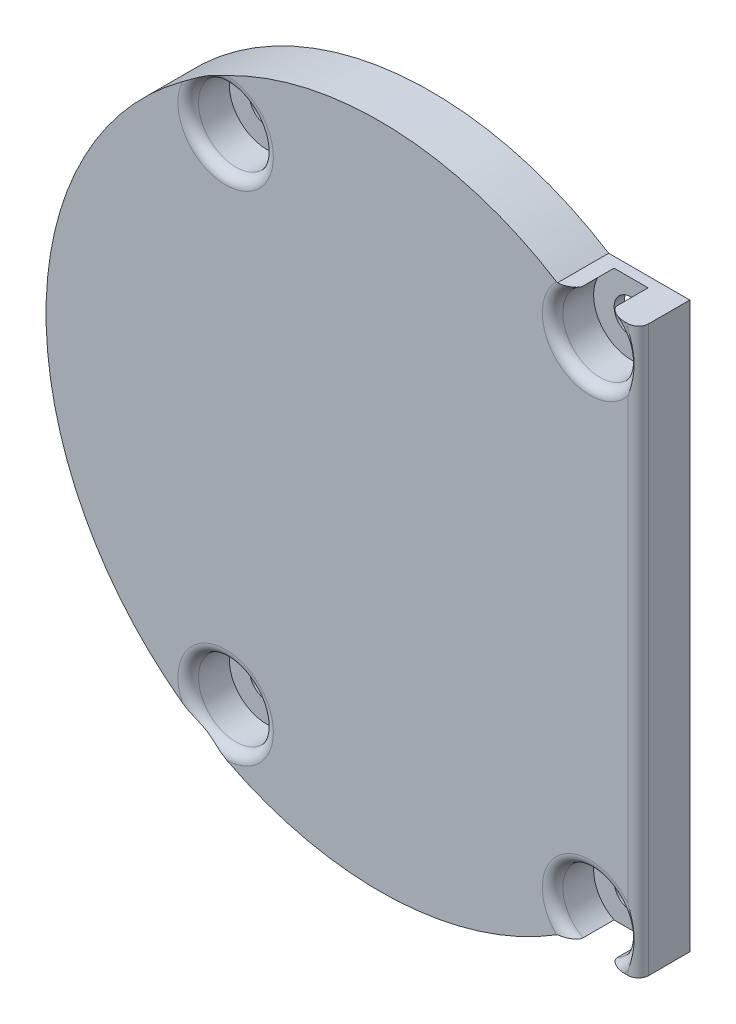
ISO-10303-21;
HEADER;
FILE_DESCRIPTION(('STEP AP214'),'2;1');
FILE_NAME('part.step','',(''),(''),'','','');
FILE_SCHEMA(('AUTOMOTIVE_DESIGN { 1 0 10303 214 1 1 1 1 }'));
ENDSEC;
DATA;
#1=APPLICATION_CONTEXT('core data for automotive mechanical design processes');
#2=APPLICATION_PROTOCOL_DEFINITION('international standard','automotive_design',2000,#1);
#3=PRODUCT_CONTEXT('',#1,'mechanical');
#4=PRODUCT('Part','Part','',(#3));
#5=PRODUCT_RELATED_PRODUCT_CATEGORY('part','',(#4));
#6=PRODUCT_DEFINITION_FORMATION('','',#4);
#7=PRODUCT_DEFINITION_CONTEXT('part definition',#1,'design');
#8=PRODUCT_DEFINITION('design','',#6,#7);
#9=PRODUCT_DEFINITION_SHAPE('','',#8);
#10=(LENGTH_UNIT() NAMED_UNIT(*) SI_UNIT(.MILLI.,.METRE.));
#11=(NAMED_UNIT(*) PLANE_ANGLE_UNIT() SI_UNIT($,.RADIAN.));
#12=(NAMED_UNIT(*) SI_UNIT($,.STERADIAN.) SOLID_ANGLE_UNIT());
#13=UNCERTAINTY_MEASURE_WITH_UNIT(LENGTH_MEASURE(1.E-05),#10,'distance_accuracy_value','');
#14=(GEOMETRIC_REPRESENTATION_CONTEXT(3) GLOBAL_UNCERTAINTY_ASSIGNED_CONTEXT((#13)) GLOBAL_UNIT_ASSIGNED_CONTEXT((#10,
#11,#12)) REPRESENTATION_CONTEXT('',''));
#15=CARTESIAN_POINT('',(0.,0.,0.));
#16=DIRECTION('',(0.,0.,1.));
#17=DIRECTION('',(1.,0.,0.));
#18=AXIS2_PLACEMENT_3D('',#15,#16,#17);
#19=CARTESIAN_POINT('',(0.,0.,5.));
#20=DIRECTION('',(0.,0.,1.));
#21=DIRECTION('',(1.,0.,0.));
#22=AXIS2_PLACEMENT_3D('',#19,#20,#21);
#23=PLANE('',#22);
#24=DIRECTION('',(-1.,0.,0.));
#25=VECTOR('',#24,1.);
#26=CARTESIAN_POINT('',(0.,-27.5,5.));
#27=LINE('',#26,#25);
#28=CARTESIAN_POINT('',(24.22,-27.5,5.));
#29=VERTEX_POINT('',#28);
#30=CARTESIAN_POINT('',(23.8256578296632,-27.5,5.));
#31=VERTEX_POINT('',#30);
#32=EDGE_CURVE('E193',#29,#31,#27,.T.);
#33=ORIENTED_EDGE('',*,*,#32,.F.);
#34=DIRECTION('',(0.,-1.,0.));
#35=VECTOR('',#34,1.);
#36=CARTESIAN_POINT('',(24.22,0.,5.));
#37=LINE('',#36,#35);
#38=CARTESIAN_POINT('',(24.22,-27.04,5.));
#39=VERTEX_POINT('',#38);
#40=EDGE_CURVE('E247',#29,#39,#37,.F.);
#41=ORIENTED_EDGE('',*,*,#40,.T.);
#42=CARTESIAN_POINT('',(20.5,-24.25,5.));
#43=DIRECTION('',(0.,0.,1.));
#44=DIRECTION('',(1.,0.,0.));
#45=AXIS2_PLACEMENT_3D('',#42,#43,#44);
#46=CIRCLE('',#45,4.65);
#47=EDGE_CURVE('E245',#39,#31,#46,.F.);
#48=ORIENTED_EDGE('',*,*,#47,.T.);
#49=EDGE_LOOP('',(#33,#41,#48));
#50=FACE_BOUND('',#49,.T.);
#51=ADVANCED_FACE('F41',(#50),#23,.T.);
#52=CARTESIAN_POINT('',(20.5,24.25,5.));
#53=DIRECTION('',(0.,0.,1.));
#54=DIRECTION('',(1.,0.,0.));
#55=AXIS2_PLACEMENT_3D('',#52,#53,#54);
#56=CIRCLE('',#55,4.65);
#57=CARTESIAN_POINT('',(23.8256578296632,27.5,5.));
#58=VERTEX_POINT('',#57);
#59=CARTESIAN_POINT('',(24.22,27.04,5.));
#60=VERTEX_POINT('',#59);
#61=EDGE_CURVE('E241',#58,#60,#56,.F.);
#62=ORIENTED_EDGE('',*,*,#61,.T.);
#63=DIRECTION('',(0.,-1.,0.));
#64=VECTOR('',#63,1.);
#65=CARTESIAN_POINT('',(24.22,0.,5.));
#66=LINE('',#65,#64);
#67=CARTESIAN_POINT('',(24.22,27.5,5.));
#68=VERTEX_POINT('',#67);
#69=EDGE_CURVE('E243',#60,#68,#66,.F.);
#70=ORIENTED_EDGE('',*,*,#69,.T.);
#71=DIRECTION('',(-1.,0.,0.));
#72=VECTOR('',#71,1.);
#73=CARTESIAN_POINT('',(0.,27.5,5.));
#74=LINE('',#73,#72);
#75=EDGE_CURVE('E184',#68,#58,#74,.T.);
#76=ORIENTED_EDGE('',*,*,#75,.T.);
#77=EDGE_LOOP('',(#62,#70,#76));
#78=FACE_BOUND('',#77,.T.);
#79=ADVANCED_FACE('F355',(#78),#23,.T.);
#80=CARTESIAN_POINT('',(-15.,24.25,5.));
#81=DIRECTION('',(0.,0.,-1.));
#82=DIRECTION('',(-1.,0.,0.));
#83=AXIS2_PLACEMENT_3D('',#80,#81,#82);
#84=CYLINDRICAL_SURFACE('',#83,1.65);
#85=CARTESIAN_POINT('',(-15.,24.25,0.));
#86=DIRECTION('',(0.,0.,1.));
#87=DIRECTION('',(1.,0.,0.));
#88=AXIS2_PLACEMENT_3D('',#85,#86,#87);
#89=CIRCLE('',#88,1.65);
#90=CARTESIAN_POINT('',(-13.35,24.25,0.));
#91=VERTEX_POINT('',#90);
#92=EDGE_CURVE('E216',#91,#91,#89,.T.);
#93=ORIENTED_EDGE('',*,*,#92,.F.);
#94=EDGE_LOOP('',(#93));
#95=FACE_BOUND('',#94,.T.);
#96=CARTESIAN_POINT('',(-15.,24.25,1.));
#97=DIRECTION('',(0.,0.,1.));
#98=DIRECTION('',(1.,0.,0.));
#99=AXIS2_PLACEMENT_3D('',#96,#97,#98);
#100=CIRCLE('',#99,1.65);
#101=CARTESIAN_POINT('',(-13.35,24.25,1.));
#102=VERTEX_POINT('',#101);
#103=EDGE_CURVE('E201',#102,#102,#100,.T.);
#104=ORIENTED_EDGE('',*,*,#103,.T.);
#105=EDGE_LOOP('',(#104));
#106=FACE_BOUND('',#105,.T.);
#107=ADVANCED_FACE('F363',(#95,#106),#84,.F.);
#108=CARTESIAN_POINT('',(20.5,24.25,5.));
#109=DIRECTION('',(0.,0.,-1.));
#110=DIRECTION('',(-1.,0.,0.));
#111=AXIS2_PLACEMENT_3D('',#108,#109,#110);
#112=CYLINDRICAL_SURFACE('',#111,1.65);
#113=CARTESIAN_POINT('',(20.5,24.25,0.));
#114=DIRECTION('',(0.,0.,1.));
#115=DIRECTION('',(1.,0.,0.));
#116=AXIS2_PLACEMENT_3D('',#113,#114,#115);
#117=CIRCLE('',#116,1.65);
#118=CARTESIAN_POINT('',(22.15,24.25,0.));
#119=VERTEX_POINT('',#118);
#120=EDGE_CURVE('E188',#119,#119,#117,.T.);
#121=ORIENTED_EDGE('',*,*,#120,.F.);
#122=EDGE_LOOP('',(#121));
#123=FACE_BOUND('',#122,.T.);
#124=CARTESIAN_POINT('',(20.5,24.25,1.));
#125=DIRECTION('',(0.,0.,1.));
#126=DIRECTION('',(1.,0.,0.));
#127=AXIS2_PLACEMENT_3D('',#124,#125,#126);
#128=CIRCLE('',#127,1.65);
#129=CARTESIAN_POINT('',(22.15,24.25,1.));
#130=VERTEX_POINT('',#129);
#131=EDGE_CURVE('E171',#130,#130,#128,.T.);
#132=ORIENTED_EDGE('',*,*,#131,.T.);
#133=EDGE_LOOP('',(#132));
#134=FACE_BOUND('',#133,.T.);
#135=ADVANCED_FACE('F459',(#123,#134),#112,.F.);
#136=CARTESIAN_POINT('',(0.,27.5,5.));
#137=DIRECTION('',(0.,-1.,0.));
#138=DIRECTION('',(0.,0.,-1.));
#139=AXIS2_PLACEMENT_3D('',#136,#137,#138);
#140=PLANE('',#139);
#141=ORIENTED_EDGE('',*,*,#75,.F.);
#142=CARTESIAN_POINT('',(24.22,27.5,4.));
#143=DIRECTION('',(0.,-1.,0.));
#144=DIRECTION('',(0.,0.,-1.));
#145=AXIS2_PLACEMENT_3D('',#142,#143,#144);
#146=CIRCLE('',#145,1.);
#147=CARTESIAN_POINT('',(25.22,27.5,4.));
#148=VERTEX_POINT('',#147);
#149=EDGE_CURVE('E315',#68,#148,#146,.F.);
#150=ORIENTED_EDGE('',*,*,#149,.T.);
#151=DIRECTION('',(0.,0.,-1.));
#152=VECTOR('',#151,1.);
#153=CARTESIAN_POINT('',(25.22,27.5,5.));
#154=LINE('',#153,#152);
#155=CARTESIAN_POINT('',(25.22,27.5,0.));
#156=VERTEX_POINT('',#155);
#157=EDGE_CURVE('E196',#148,#156,#154,.T.);
#158=ORIENTED_EDGE('',*,*,#157,.T.);
#159=DIRECTION('',(-1.,0.,0.));
#160=VECTOR('',#159,1.);
#161=CARTESIAN_POINT('',(0.,27.5,0.));
#162=LINE('',#161,#160);
#163=CARTESIAN_POINT('',(17.3205080756888,27.5,0.));
#164=VERTEX_POINT('',#163);
#165=EDGE_CURVE('E197',#156,#164,#162,.T.);
#166=ORIENTED_EDGE('',*,*,#165,.T.);
#167=DIRECTION('',(0.,0.,-1.));
#168=VECTOR('',#167,1.);
#169=CARTESIAN_POINT('',(17.3205080756888,27.5,5.));
#170=LINE('',#169,#168);
#171=CARTESIAN_POINT('',(17.3205080756888,27.5,4.99464096715428));
#172=VERTEX_POINT('',#171);
#173=EDGE_CURVE('E226',#172,#164,#170,.T.);
#174=ORIENTED_EDGE('',*,*,#173,.F.);
#175=CARTESIAN_POINT('',(17.3205080756888,27.5,4.99464096715428));
#176=CARTESIAN_POINT('',(17.3828790474889,27.5,4.99009142860643));
#177=CARTESIAN_POINT('',(17.4450181860973,27.5,4.98275836930483));
#178=CARTESIAN_POINT('',(17.5684547154544,27.5,4.96285672825504));
#179=CARTESIAN_POINT('',(17.6297521255033,27.5,4.9502882667581));
#180=CARTESIAN_POINT('',(17.7518465696262,27.5,4.92006975309291));
#181=CARTESIAN_POINT('',(17.8126291506009,27.5,4.90236145474365));
#182=CARTESIAN_POINT('',(17.9325490366379,27.5,4.86212811210646));
#183=CARTESIAN_POINT('',(17.9916866296559,27.5,4.83960391691611));
#184=CARTESIAN_POINT('',(18.1355134593122,27.5,4.77799536233345));
#185=CARTESIAN_POINT('',(18.2190502866487,27.5,4.73611853994865));
#186=CARTESIAN_POINT('',(18.3392470513107,27.5,4.66516004240109));
#187=CARTESIAN_POINT('',(18.3783835143496,27.5,4.64021153857189));
#188=CARTESIAN_POINT('',(18.4545721035768,27.5,4.58732439040671));
#189=CARTESIAN_POINT('',(18.4916256661943,27.5,4.55938784628193));
#190=CARTESIAN_POINT('',(18.5593554609764,27.5,4.50312309972547));
#191=CARTESIAN_POINT('',(18.5902980625983,27.5,4.47511810573673));
#192=CARTESIAN_POINT('',(18.6491522529167,27.5,4.41589568943837));
#193=CARTESIAN_POINT('',(18.6770563324222,27.5,4.38467066390243));
#194=CARTESIAN_POINT('',(18.7287536654706,27.5,4.31807857726737));
#195=CARTESIAN_POINT('',(18.7524722766361,27.5,4.28265215906765));
#196=CARTESIAN_POINT('',(18.7926502966015,27.5,4.20802949939521));
#197=CARTESIAN_POINT('',(18.8091657438844,27.5,4.16886535809995));
#198=CARTESIAN_POINT('',(18.8264501627813,27.5,4.10752059767951));
#199=CARTESIAN_POINT('',(18.8309701875317,27.5,4.08638836247423));
#200=CARTESIAN_POINT('',(18.8371113050438,27.5,4.04352053110726));
#201=CARTESIAN_POINT('',(18.8387063539978,27.5,4.02178124769761));
#202=CARTESIAN_POINT('',(18.8386752274164,27.5,4.));
#203=B_SPLINE_CURVE_WITH_KNOTS('',3,(#175,#176,#177,#178,#179,#180,#181,#182,#183,#184,#185,
#186,#187,#188,#189,#190,#191,#192,#193,#194,#195,#196,#197,#198,#199,#200,#201,#202),
.UNSPECIFIED.,.F.,.F.,(4,2,2,2,2,2,2,2,2,2,2,2,2,4),(0.,0.187504599467662,0.375004892405204,
0.564718999321541,0.754399685017374,1.03384638336378,1.17298019003124,1.31201683815318,
1.43704145183084,1.56236834707428,1.68974361312042,1.81610944930768,1.88075146970428,
1.94596631496202),.UNSPECIFIED.);
#204=CARTESIAN_POINT('',(18.8386752274164,27.5,4.));
#205=VERTEX_POINT('',#204);
#206=EDGE_CURVE('E63',#172,#205,#203,.T.);
#207=ORIENTED_EDGE('',*,*,#206,.T.);
#208=DIRECTION('',(0.,0.,1.));
#209=VECTOR('',#208,1.);
#210=CARTESIAN_POINT('',(18.8386752274164,27.5,1.));
#211=LINE('',#210,#209);
#212=CARTESIAN_POINT('',(18.8386752274164,27.5,1.));
#213=VERTEX_POINT('',#212);
#214=EDGE_CURVE('E159',#205,#213,#211,.F.);
#215=ORIENTED_EDGE('',*,*,#214,.T.);
#216=DIRECTION('',(-1.,0.,0.));
#217=VECTOR('',#216,1.);
#218=CARTESIAN_POINT('',(0.,27.5,1.));
#219=LINE('',#218,#217);
#220=CARTESIAN_POINT('',(22.1613247725836,27.5,1.));
#221=VERTEX_POINT('',#220);
#222=EDGE_CURVE('E164',#221,#213,#219,.T.);
#223=ORIENTED_EDGE('',*,*,#222,.F.);
#224=DIRECTION('',(0.,0.,1.));
#225=VECTOR('',#224,1.);
#226=CARTESIAN_POINT('',(22.1613247725836,27.5,1.));
#227=LINE('',#226,#225);
#228=CARTESIAN_POINT('',(22.1613247725836,27.5,4.));
#229=VERTEX_POINT('',#228);
#230=EDGE_CURVE('E152',#221,#229,#227,.T.);
#231=ORIENTED_EDGE('',*,*,#230,.T.);
#232=CARTESIAN_POINT('',(22.1613247725836,27.5,4.));
#233=CARTESIAN_POINT('',(22.161234788376,27.5,4.02881316831526));
#234=CARTESIAN_POINT('',(22.1640573019387,27.5,4.05749707146572));
#235=CARTESIAN_POINT('',(22.1746587968337,27.5,4.11354196173756));
#236=CARTESIAN_POINT('',(22.1823686565779,27.5,4.14091576200059));
#237=CARTESIAN_POINT('',(22.2049060647443,27.5,4.20223978218347));
#238=CARTESIAN_POINT('',(22.2211888821668,27.5,4.23564269832899));
#239=CARTESIAN_POINT('',(22.2588251093988,27.5,4.29961981089831));
#240=CARTESIAN_POINT('',(22.2802101804649,27.5,4.33017461807436));
#241=CARTESIAN_POINT('',(22.343589801627,27.5,4.41007623912104));
#242=CARTESIAN_POINT('',(22.3891194039015,27.5,4.45658417072956));
#243=CARTESIAN_POINT('',(22.4861792763598,27.5,4.54273859815138));
#244=CARTESIAN_POINT('',(22.5377238021491,27.5,4.5823682161503));
#245=CARTESIAN_POINT('',(22.6396894568337,27.5,4.65234558296308));
#246=CARTESIAN_POINT('',(22.6897550562348,27.5,4.68321685267553));
#247=CARTESIAN_POINT('',(22.7923262651521,27.5,4.74065229937634));
#248=CARTESIAN_POINT('',(22.844833642067,27.5,4.76721329206493));
#249=CARTESIAN_POINT('',(22.9517283595593,27.5,4.81618752442084));
#250=CARTESIAN_POINT('',(23.006115173138,27.5,4.83860191578365));
#251=CARTESIAN_POINT('',(23.1164155691819,27.5,4.87930218224487));
#252=CARTESIAN_POINT('',(23.1723296610987,27.5,4.89758666040925));
#253=CARTESIAN_POINT('',(23.3259458934983,27.5,4.94150788304256));
#254=CARTESIAN_POINT('',(23.424885059058,27.5,4.96302609309769));
#255=CARTESIAN_POINT('',(23.5745658110709,27.5,4.98494979561266));
#256=CARTESIAN_POINT('',(23.6245971525041,27.5,4.99053145693196));
#257=CARTESIAN_POINT('',(23.7249596191854,27.5,4.99805443797021));
#258=CARTESIAN_POINT('',(23.7752909020243,27.5,4.99999363616446));
#259=CARTESIAN_POINT('',(23.8256578296632,27.5,5.));
#260=B_SPLINE_CURVE_WITH_KNOTS('',3,(#232,#233,#234,#235,#236,#237,#238,#239,#240,#241,#242,
#243,#244,#245,#246,#247,#248,#249,#250,#251,#252,#253,#254,#255,#256,#257,#258,#259),
.UNSPECIFIED.,.F.,.F.,(4,2,2,2,2,2,2,2,2,2,2,2,2,4),(0.,0.0860938107178456,0.170996366378072,
0.281850001669151,0.3934102827039,0.587580667727814,0.782220966200827,0.958436507701893,
1.13478164492187,1.311077729484,1.48743335680389,1.79014488624238,1.94105899128791,
2.09206096787239),.UNSPECIFIED.);
#261=EDGE_CURVE('E317',#229,#58,#260,.T.);
#262=ORIENTED_EDGE('',*,*,#261,.T.);
#263=EDGE_LOOP('',(#141,#150,#158,#166,#174,#207,#215,#223,#231,#262));
#264=FACE_BOUND('',#263,.T.);
#265=ADVANCED_FACE('F169',(#264),#140,.F.);
#266=CARTESIAN_POINT('',(0.,0.,5.));
#267=DIRECTION('',(0.,0.,-1.));
#268=DIRECTION('',(-1.,0.,0.));
#269=AXIS2_PLACEMENT_3D('',#266,#267,#268);
#270=CYLINDRICAL_SURFACE('',#269,32.5);
#271=CARTESIAN_POINT('',(0.,0.,5.));
#272=DIRECTION('',(0.,0.,1.));
#273=DIRECTION('',(1.,0.,0.));
#274=AXIS2_PLACEMENT_3D('',#271,#272,#273);
#275=CIRCLE('',#274,32.5);
#276=CARTESIAN_POINT('',(-19.2167029631442,26.2100806413541,5.));
#277=VERTEX_POINT('',#276);
#278=CARTESIAN_POINT('',(-19.2167029631442,-26.2100806413541,5.));
#279=VERTEX_POINT('',#278);
#280=EDGE_CURVE('E191',#277,#279,#275,.T.);
#281=ORIENTED_EDGE('',*,*,#280,.F.);
#282=CARTESIAN_POINT('',(-19.2167029631442,26.2100806413541,5.));
#283=CARTESIAN_POINT('',(-19.1484691752489,26.2601091307012,4.99998653440412));
#284=CARTESIAN_POINT('',(-19.0800806336055,26.309839792648,4.9975065893898));
#285=CARTESIAN_POINT('',(-18.9431563245321,26.4085957993154,4.98859544501767));
#286=CARTESIAN_POINT('',(-18.8746207984228,26.4576218529249,4.98216855002591));
#287=CARTESIAN_POINT('',(-18.6687310800508,26.6036996918003,4.95841761903576));
#288=CARTESIAN_POINT('',(-18.5311757348163,26.6996910634795,4.93662569383857));
#289=CARTESIAN_POINT('',(-18.2568060461511,26.888035137919,4.88890069317151));
#290=CARTESIAN_POINT('',(-18.1200017290448,26.9804171970852,4.86301880020676));
#291=CARTESIAN_POINT('',(-17.9136464490216,27.1174858789882,4.82690475222086));
#292=CARTESIAN_POINT('',(-17.8447913236716,27.1628466691084,4.81533608415042));
#293=CARTESIAN_POINT('',(-17.7065071322506,27.2531912066829,4.79413414903406));
#294=CARTESIAN_POINT('',(-17.6370779507109,27.2981748744261,4.78450128173638));
#295=CARTESIAN_POINT('',(-17.5132633944347,27.3777233760046,4.76999154335342));
#296=CARTESIAN_POINT('',(-17.4589954868081,27.4123627453664,4.76453256967856));
#297=CARTESIAN_POINT('',(-17.3501323413354,27.481394821811,4.75575514804199));
#298=CARTESIAN_POINT('',(-17.2955371296525,27.5157875481393,4.75243653123278));
#299=CARTESIAN_POINT('',(-17.186098696482,27.5842740739222,4.74819111287832));
#300=CARTESIAN_POINT('',(-17.1312555972411,27.6183680005567,4.74726323901094));
#301=CARTESIAN_POINT('',(-17.0213770967676,27.6862220446478,4.74786875067792));
#302=CARTESIAN_POINT('',(-16.9663416954074,27.7199821618831,4.7494021378455));
#303=CARTESIAN_POINT('',(-16.8558296931531,27.7873211658405,4.75482720256567));
#304=CARTESIAN_POINT('',(-16.8003524134451,27.8208977846993,4.75873283496536));
#305=CARTESIAN_POINT('',(-16.6893318719031,27.8876387825785,4.76861962255588));
#306=CARTESIAN_POINT('',(-16.6337886044046,27.920803122909,4.7746009710394));
#307=CARTESIAN_POINT('',(-16.467010312445,28.0197126331169,4.7950592539485));
#308=CARTESIAN_POINT('',(-16.3557144086999,28.0848209196305,4.81204493614168));
#309=CARTESIAN_POINT('',(-16.1310799388175,28.2144525832734,4.84907069900712));
#310=CARTESIAN_POINT('',(-16.0177355960409,28.2789528894577,4.86915241929857));
#311=CARTESIAN_POINT('',(-15.7902396347076,28.4066071037043,4.90815877355342));
#312=CARTESIAN_POINT('',(-15.6760889438045,28.4697623019366,4.92708455211261));
#313=CARTESIAN_POINT('',(-15.4476529681246,28.5943480635954,4.96000913414021));
#314=CARTESIAN_POINT('',(-15.333381835972,28.6557897968025,4.97405785946662));
#315=CARTESIAN_POINT('',(-15.1032404952512,28.7777545945473,4.9940406864099));
#316=CARTESIAN_POINT('',(-14.9873664873131,28.8382743067546,4.99995004205587));
#317=CARTESIAN_POINT('',(-14.8708979285462,28.8982074668786,5.));
#318=B_SPLINE_CURVE_WITH_KNOTS('',3,(#282,#283,#284,#285,#286,#287,#288,#289,#290,#291,#292,
#293,#294,#295,#296,#297,#298,#299,#300,#301,#302,#303,#304,#305,#306,#307,#308,#309,#310,#311,
#312,#313,#314,#315,#316,#317),.UNSPECIFIED.,.F.,.F.,(4,2,2,2,2,2,2,2,2,2,2,2,2,2,2,2,2,4),(0.,
0.25371869257178,0.507161181093159,1.01435023547407,1.51563267030712,1.76540163824238,
2.01522213128026,2.20902687109415,2.40281632025827,2.59651883372045,2.79022147571845,
2.98507476981981,3.17994621372018,3.56999681525273,3.96584387918632,4.36129240534337,
4.75256469085178,5.14502394768603),.UNSPECIFIED.);
#319=CARTESIAN_POINT('',(-14.8708979285462,28.8982074668786,5.));
#320=VERTEX_POINT('',#319);
#321=EDGE_CURVE('E293',#277,#320,#318,.T.);
#322=ORIENTED_EDGE('',*,*,#321,.T.);
#323=CARTESIAN_POINT('',(17.2304975462288,27.5564866104045,5.));
#324=VERTEX_POINT('',#323);
#325=EDGE_CURVE('E192',#324,#320,#275,.T.);
#326=ORIENTED_EDGE('',*,*,#325,.F.);
#327=CARTESIAN_POINT('',(17.2304975462288,27.5564866104045,5.));
#328=CARTESIAN_POINT('',(17.2455528214014,27.5470727733782,4.99999930945277));
#329=CARTESIAN_POINT('',(17.2605813394796,27.5376586354186,4.9995523777459));
#330=CARTESIAN_POINT('',(17.2905848492561,27.5188297652832,4.9977660327387));
#331=CARTESIAN_POINT('',(17.3055598409978,27.5094150331081,4.99642662016367));
#332=CARTESIAN_POINT('',(17.3205080756888,27.5,4.99464096715428));
#333=B_SPLINE_CURVE_WITH_KNOTS('',3,(#327,#328,#329,#330,#331,#332),.UNSPECIFIED.,.F.,.F.,(4,2,
4),(0.,0.0532178435669511,0.106435643885812),.UNSPECIFIED.);
#334=EDGE_CURVE('E255',#324,#172,#333,.T.);
#335=ORIENTED_EDGE('',*,*,#334,.T.);
#336=ORIENTED_EDGE('',*,*,#173,.T.);
#337=CARTESIAN_POINT('',(0.,0.,0.));
#338=DIRECTION('',(0.,0.,1.));
#339=DIRECTION('',(1.,0.,0.));
#340=AXIS2_PLACEMENT_3D('',#337,#338,#339);
#341=CIRCLE('',#340,32.5);
#342=CARTESIAN_POINT('',(17.3205080756888,-27.5,0.));
#343=VERTEX_POINT('',#342);
#344=EDGE_CURVE('E200',#164,#343,#341,.T.);
#345=ORIENTED_EDGE('',*,*,#344,.T.);
#346=DIRECTION('',(0.,0.,-1.));
#347=VECTOR('',#346,1.);
#348=CARTESIAN_POINT('',(17.3205080756888,-27.5,5.));
#349=LINE('',#348,#347);
#350=CARTESIAN_POINT('',(17.3205080756888,-27.5,4.99464096715428));
#351=VERTEX_POINT('',#350);
#352=EDGE_CURVE('E224',#351,#343,#349,.T.);
#353=ORIENTED_EDGE('',*,*,#352,.F.);
#354=CARTESIAN_POINT('',(17.3205080756888,-27.5,4.99464096715428));
#355=CARTESIAN_POINT('',(17.3055598409978,-27.5094150331081,4.99642662016367));
#356=CARTESIAN_POINT('',(17.2905848492561,-27.5188297652832,4.9977660327387));
#357=CARTESIAN_POINT('',(17.2605813394796,-27.5376586354185,4.9995523777459));
#358=CARTESIAN_POINT('',(17.2455528214014,-27.5470727733782,4.99999930945277));
#359=CARTESIAN_POINT('',(17.2304975462288,-27.5564866104045,5.));
#360=B_SPLINE_CURVE_WITH_KNOTS('',3,(#354,#355,#356,#357,#358,#359),.UNSPECIFIED.,.F.,.F.,(4,2,
4),(0.,0.0532178003188651,0.106435643885814),.UNSPECIFIED.);
#361=CARTESIAN_POINT('',(17.2304975462288,-27.5564866104045,5.));
#362=VERTEX_POINT('',#361);
#363=EDGE_CURVE('E263',#351,#362,#360,.T.);
#364=ORIENTED_EDGE('',*,*,#363,.T.);
#365=CARTESIAN_POINT('',(-14.8708979285462,-28.8982074668786,5.));
#366=VERTEX_POINT('',#365);
#367=EDGE_CURVE('E187',#366,#362,#275,.T.);
#368=ORIENTED_EDGE('',*,*,#367,.F.);
#369=CARTESIAN_POINT('',(-14.8708979285462,-28.8982074668786,5.));
#370=CARTESIAN_POINT('',(-14.9461305897718,-28.8594938227489,4.99998653440412));
#371=CARTESIAN_POINT('',(-15.0211658686916,-28.8205087193989,4.9975065893898));
#372=CARTESIAN_POINT('',(-15.1706710750115,-28.7420918299468,4.98859544501767));
#373=CARTESIAN_POINT('',(-15.2451415289421,-28.702660576315,4.98216855002591));
#374=CARTESIAN_POINT('',(-15.4677842700085,-28.5836667907955,4.95841761903577));
#375=CARTESIAN_POINT('',(-15.6150975582561,-28.5034507603209,4.93662569383857));
#376=CARTESIAN_POINT('',(-15.9061374958325,-28.3420569216212,4.88890069317151));
#377=CARTESIAN_POINT('',(-16.0498859351257,-28.2609011933239,4.86301880020677));
#378=CARTESIAN_POINT('',(-16.264675486898,-28.1374679174152,4.82690475222086));
#379=CARTESIAN_POINT('',(-16.336009103637,-28.0961140217072,4.81533608415042));
#380=CARTESIAN_POINT('',(-16.4785952582477,-28.0127243246228,4.79413414903406));
#381=CARTESIAN_POINT('',(-16.5498477763579,-27.9706883843352,4.78450128173638));
#382=CARTESIAN_POINT('',(-16.6763127864112,-27.8954247830295,4.76999154335342));
#383=CARTESIAN_POINT('',(-16.7315395167343,-27.8623355103605,4.76453256967856));
#384=CARTESIAN_POINT('',(-16.841918437625,-27.7957539375082,4.75575514804199));
#385=CARTESIAN_POINT('',(-16.8970706337297,-27.7622616693286,4.75243653123279));
#386=CARTESIAN_POINT('',(-17.007218302144,-27.6949217405231,4.74819111287832));
#387=CARTESIAN_POINT('',(-17.0622138336618,-27.6610742460696,4.74726323901094));
#388=CARTESIAN_POINT('',(-17.1719920858312,-27.5930581338868,4.74786875067792));
#389=CARTESIAN_POINT('',(-17.2267748063416,-27.5588895159444,4.7494021378455));
#390=CARTESIAN_POINT('',(-17.3363751005347,-27.4900765839549,4.75482720256567));
#391=CARTESIAN_POINT('',(-17.391190948128,-27.4554306498439,4.75873283496536));
#392=CARTESIAN_POINT('',(-17.5004832489298,-27.3858956627681,4.76861962255588));
#393=CARTESIAN_POINT('',(-17.5549596700496,-27.3510065874585,4.7746009710394));
#394=CARTESIAN_POINT('',(-17.7179331343292,-27.2459459391679,4.7950592539485));
#395=CARTESIAN_POINT('',(-17.8258875012961,-27.1754355015298,4.81204493614168));
#396=CARTESIAN_POINT('',(-18.0421850030526,-27.0323257394166,4.84907069900712));
#397=CARTESIAN_POINT('',(-18.1505100742475,-26.9597109441753,4.86915241929857));
#398=CARTESIAN_POINT('',(-18.3663159850182,-26.8131578148524,4.90815877355342));
#399=CARTESIAN_POINT('',(-18.4737975647615,-26.7392208869116,4.92708455211261));
#400=CARTESIAN_POINT('',(-18.6872776822518,-26.5904564878466,4.96000913414021));
#401=CARTESIAN_POINT('',(-18.793279894659,-26.5156466677177,4.97405785946662));
#402=CARTESIAN_POINT('',(-19.005176373558,-26.3641860100276,4.9940406864099));
#403=CARTESIAN_POINT('',(-19.1110693370607,-26.287530275983,4.99995004205587));
#404=CARTESIAN_POINT('',(-19.2167029631442,-26.2100806413541,5.));
#405=B_SPLINE_CURVE_WITH_KNOTS('',3,(#369,#370,#371,#372,#373,#374,#375,#376,#377,#378,#379,
#380,#381,#382,#383,#384,#385,#386,#387,#388,#389,#390,#391,#392,#393,#394,#395,#396,#397,#398,
#399,#400,#401,#402,#403,#404),.UNSPECIFIED.,.F.,.F.,(4,2,2,2,2,2,2,2,2,2,2,2,2,2,2,2,2,4),(0.,
0.25371869257178,0.507161181093161,1.01435023547406,1.51563267030712,1.76540163824238,
2.01522213128026,2.20902687109416,2.40281632025827,2.59651883372045,2.79022147571845,
2.98507476981981,3.17994621372018,3.56999681525272,3.96584387918632,4.36129240534336,
4.75256469085179,5.14502394768604),.UNSPECIFIED.);
#406=EDGE_CURVE('E287',#366,#279,#405,.T.);
#407=ORIENTED_EDGE('',*,*,#406,.T.);
#408=EDGE_LOOP('',(#281,#322,#326,#335,#336,#345,#353,#364,#368,#407));
#409=FACE_BOUND('',#408,.T.);
#410=ADVANCED_FACE('F272',(#409),#270,.T.);
#411=CARTESIAN_POINT('',(0.,-27.5,5.));
#412=DIRECTION('',(0.,-1.,0.));
#413=DIRECTION('',(0.,0.,-1.));
#414=AXIS2_PLACEMENT_3D('',#411,#412,#413);
#415=PLANE('',#414);
#416=DIRECTION('',(0.,0.,-1.));
#417=VECTOR('',#416,1.);
#418=CARTESIAN_POINT('',(25.22,-27.5,5.));
#419=LINE('',#418,#417);
#420=CARTESIAN_POINT('',(25.22,-27.5,4.));
#421=VERTEX_POINT('',#420);
#422=CARTESIAN_POINT('',(25.22,-27.5,0.));
#423=VERTEX_POINT('',#422);
#424=EDGE_CURVE('E222',#421,#423,#419,.T.);
#425=ORIENTED_EDGE('',*,*,#424,.F.);
#426=CARTESIAN_POINT('',(24.22,-27.5,4.));
#427=DIRECTION('',(0.,-1.,0.));
#428=DIRECTION('',(0.,0.,-1.));
#429=AXIS2_PLACEMENT_3D('',#426,#427,#428);
#430=CIRCLE('',#429,1.);
#431=EDGE_CURVE('E328',#421,#29,#430,.T.);
#432=ORIENTED_EDGE('',*,*,#431,.T.);
#433=ORIENTED_EDGE('',*,*,#32,.T.);
#434=CARTESIAN_POINT('',(23.8256578296632,-27.5,5.));
#435=CARTESIAN_POINT('',(23.7658060454977,-27.5,4.99998825718349));
#436=CARTESIAN_POINT('',(23.7059866174115,-27.5,4.99725201525578));
#437=CARTESIAN_POINT('',(23.5868315897642,-27.5,4.98669072493214));
#438=CARTESIAN_POINT('',(23.5274957123518,-27.5,4.97886884349281));
#439=CARTESIAN_POINT('',(23.4087745962097,-27.5,4.9583439629306));
#440=CARTESIAN_POINT('',(23.3494017644106,-27.5,4.94557005488026));
#441=CARTESIAN_POINT('',(23.2318319293357,-27.5,4.91541958199549));
#442=CARTESIAN_POINT('',(23.173635067872,-27.5,4.89804246557642));
#443=CARTESIAN_POINT('',(23.0574558353273,-27.5,4.85841566864224));
#444=CARTESIAN_POINT('',(22.9995079276738,-27.5,4.83606489999823));
#445=CARTESIAN_POINT('',(22.8856004123769,-27.5,4.78677223810888));
#446=CARTESIAN_POINT('',(22.8296405224007,-27.5,4.75983099996482));
#447=CARTESIAN_POINT('',(22.7206085707156,-27.5,4.70138342796896));
#448=CARTESIAN_POINT('',(22.6675202677714,-27.5,4.66990753020992));
#449=CARTESIAN_POINT('',(22.5647632560738,-27.5,4.60186097032496));
#450=CARTESIAN_POINT('',(22.5150893517301,-27.5,4.56529831702255));
#451=CARTESIAN_POINT('',(22.4361283262407,-27.5,4.49911840544067));
#452=CARTESIAN_POINT('',(22.4054807794009,-27.5,4.47113185192502));
#453=CARTESIAN_POINT('',(22.3472412470292,-27.5,4.41196699182759));
#454=CARTESIAN_POINT('',(22.3196558666426,-27.5,4.38078205453315));
#455=CARTESIAN_POINT('',(22.2686150277876,-27.5,4.31429245568078));
#456=CARTESIAN_POINT('',(22.2452351929761,-27.5,4.27892832727615));
#457=CARTESIAN_POINT('',(22.2057446788896,-27.5,4.20447085278369));
#458=CARTESIAN_POINT('',(22.1895793595202,-27.5,4.16540835168581));
#459=CARTESIAN_POINT('',(22.1729180031445,-27.5,4.10471483510992));
#460=CARTESIAN_POINT('',(22.1686282148627,-27.5,4.08411396107333));
#461=CARTESIAN_POINT('',(22.1628061953112,-27.5,4.04235678488278));
#462=CARTESIAN_POINT('',(22.1612970559447,-27.5,4.02119729878408));
#463=CARTESIAN_POINT('',(22.1613247725836,-27.5,4.));
#464=B_SPLINE_CURVE_WITH_KNOTS('',3,(#434,#435,#436,#437,#438,#439,#440,#441,#442,#443,#444,
#445,#446,#447,#448,#449,#450,#451,#452,#453,#454,#455,#456,#457,#458,#459,#460,#461,#462,#463),
.UNSPECIFIED.,.F.,.F.,(4,2,2,2,2,2,2,2,2,2,2,2,2,2,4),(0.,0.179447032126225,0.358782424927646,
0.540786705443134,0.722812804699963,0.908945734597317,1.09505212386502,1.27996303719557,
1.46458604530319,1.58892184342442,1.71352082800237,1.84017494985993,1.96585284895532,
2.02880668505229,2.09228100505293),.UNSPECIFIED.);
#465=CARTESIAN_POINT('',(22.1613247725836,-27.5,4.));
#466=VERTEX_POINT('',#465);
#467=EDGE_CURVE('E336',#31,#466,#464,.T.);
#468=ORIENTED_EDGE('',*,*,#467,.T.);
#469=DIRECTION('',(0.,0.,1.));
#470=VECTOR('',#469,1.);
#471=CARTESIAN_POINT('',(22.1613247725836,-27.5,1.));
#472=LINE('',#471,#470);
#473=CARTESIAN_POINT('',(22.1613247725836,-27.5,1.));
#474=VERTEX_POINT('',#473);
#475=EDGE_CURVE('E177',#474,#466,#472,.T.);
#476=ORIENTED_EDGE('',*,*,#475,.F.);
#477=DIRECTION('',(1.,0.,0.));
#478=VECTOR('',#477,1.);
#479=CARTESIAN_POINT('',(0.,-27.5,1.));
#480=LINE('',#479,#478);
#481=CARTESIAN_POINT('',(18.8386752274164,-27.5,1.));
#482=VERTEX_POINT('',#481);
#483=EDGE_CURVE('E174',#482,#474,#480,.T.);
#484=ORIENTED_EDGE('',*,*,#483,.F.);
#485=DIRECTION('',(0.,0.,1.));
#486=VECTOR('',#485,1.);
#487=CARTESIAN_POINT('',(18.8386752274164,-27.5,1.));
#488=LINE('',#487,#486);
#489=CARTESIAN_POINT('',(18.8386752274164,-27.5,4.));
#490=VERTEX_POINT('',#489);
#491=EDGE_CURVE('E158',#490,#482,#488,.F.);
#492=ORIENTED_EDGE('',*,*,#491,.F.);
#493=CARTESIAN_POINT('',(18.8386752274164,-27.5,4.));
#494=CARTESIAN_POINT('',(18.8387652130669,-27.5,4.02881350104966));
#495=CARTESIAN_POINT('',(18.8359426338998,-27.5,4.05749773102691));
#496=CARTESIAN_POINT('',(18.8253410245554,-27.5,4.11354259889493));
#497=CARTESIAN_POINT('',(18.8176312300288,-27.5,4.14091607123044));
#498=CARTESIAN_POINT('',(18.7950940225909,-27.5,4.20223954364744));
#499=CARTESIAN_POINT('',(18.7788113411361,-27.5,4.2356422405348));
#500=CARTESIAN_POINT('',(18.7411751821565,-27.5,4.29961939393919));
#501=CARTESIAN_POINT('',(18.7197899753438,-27.5,4.33017441961583));
#502=CARTESIAN_POINT('',(18.6564102348906,-27.5,4.41007619662237));
#503=CARTESIAN_POINT('',(18.610880689037,-27.5,4.45658408980847));
#504=CARTESIAN_POINT('',(18.5138207949336,-27.5,4.54273853323151));
#505=CARTESIAN_POINT('',(18.4622761809646,-27.5,4.58236819387921));
#506=CARTESIAN_POINT('',(18.3603046954066,-27.5,4.65234962684359));
#507=CARTESIAN_POINT('',(18.3102329433223,-27.5,4.68322434788942));
#508=CARTESIAN_POINT('',(18.2076462412659,-27.5,4.74066691849056));
#509=CARTESIAN_POINT('',(18.1551294300923,-27.5,4.76723141573101));
#510=CARTESIAN_POINT('',(18.0482296859628,-27.5,4.81620554201621));
#511=CARTESIAN_POINT('',(17.9938476929886,-27.5,4.83861722849432));
#512=CARTESIAN_POINT('',(17.8835565240681,-27.5,4.87931086843561));
#513=CARTESIAN_POINT('',(17.8276470872456,-27.5,4.89759211144444));
#514=CARTESIAN_POINT('',(17.6975060904775,-27.5,4.93480416212798));
#515=CARTESIAN_POINT('',(17.622845117516,-27.5,4.95226065302375));
#516=CARTESIAN_POINT('',(17.4724024815681,-27.5,4.97938065274334));
#517=CARTESIAN_POINT('',(17.3966257446267,-27.5,4.9890716376877));
#518=CARTESIAN_POINT('',(17.3205080756888,-27.5,4.99464096715428));
#519=B_SPLINE_CURVE_WITH_KNOTS('',3,(#493,#494,#495,#496,#497,#498,#499,#500,#501,#502,#503,
#504,#505,#506,#507,#508,#509,#510,#511,#512,#513,#514,#515,#516,#517,#518),.UNSPECIFIED.,.F.,
.F.,(4,2,2,2,2,2,2,2,2,2,2,2,4),(0.,0.086094794352184,0.170996365757048,0.281849243331975,
0.393410282882405,0.587580503805864,0.782220966573831,0.958457981134229,1.13483141528533,
1.31111723346998,1.48743335054172,1.71705056676304,1.94585171280694),.UNSPECIFIED.);
#520=EDGE_CURVE('E330',#490,#351,#519,.T.);
#521=ORIENTED_EDGE('',*,*,#520,.T.);
#522=ORIENTED_EDGE('',*,*,#352,.T.);
#523=DIRECTION('',(-1.,0.,0.));
#524=VECTOR('',#523,1.);
#525=CARTESIAN_POINT('',(0.,-27.5,0.));
#526=LINE('',#525,#524);
#527=EDGE_CURVE('E204',#423,#343,#526,.T.);
#528=ORIENTED_EDGE('',*,*,#527,.F.);
#529=EDGE_LOOP('',(#425,#432,#433,#468,#476,#484,#492,#521,#522,#528));
#530=FACE_BOUND('',#529,.T.);
#531=ADVANCED_FACE('F277',(#530),#415,.T.);
#532=CARTESIAN_POINT('',(-15.,-24.25,5.));
#533=DIRECTION('',(0.,0.,-1.));
#534=DIRECTION('',(-1.,0.,0.));
#535=AXIS2_PLACEMENT_3D('',#532,#533,#534);
#536=CYLINDRICAL_SURFACE('',#535,1.65);
#537=CARTESIAN_POINT('',(-15.,-24.25,1.));
#538=DIRECTION('',(0.,0.,-1.));
#539=DIRECTION('',(-1.,0.,0.));
#540=AXIS2_PLACEMENT_3D('',#537,#538,#539);
#541=CIRCLE('',#540,1.65);
#542=CARTESIAN_POINT('',(-16.65,-24.25,1.));
#543=VERTEX_POINT('',#542);
#544=EDGE_CURVE('E183',#543,#543,#541,.F.);
#545=ORIENTED_EDGE('',*,*,#544,.T.);
#546=EDGE_LOOP('',(#545));
#547=FACE_BOUND('',#546,.T.);
#548=CARTESIAN_POINT('',(-15.,-24.25,0.));
#549=DIRECTION('',(0.,0.,1.));
#550=DIRECTION('',(1.,0.,0.));
#551=AXIS2_PLACEMENT_3D('',#548,#549,#550);
#552=CIRCLE('',#551,1.65);
#553=CARTESIAN_POINT('',(-13.35,-24.25,0.));
#554=VERTEX_POINT('',#553);
#555=EDGE_CURVE('E213',#554,#554,#552,.F.);
#556=ORIENTED_EDGE('',*,*,#555,.T.);
#557=EDGE_LOOP('',(#556));
#558=FACE_BOUND('',#557,.T.);
#559=ADVANCED_FACE('F449',(#547,#558),#536,.F.);
#560=CARTESIAN_POINT('',(20.5,-24.25,5.));
#561=DIRECTION('',(0.,0.,-1.));
#562=DIRECTION('',(-1.,0.,0.));
#563=AXIS2_PLACEMENT_3D('',#560,#561,#562);
#564=CYLINDRICAL_SURFACE('',#563,1.65);
#565=CARTESIAN_POINT('',(20.5,-24.25,1.));
#566=DIRECTION('',(0.,0.,-1.));
#567=DIRECTION('',(-1.,0.,0.));
#568=AXIS2_PLACEMENT_3D('',#565,#566,#567);
#569=CIRCLE('',#568,1.65);
#570=CARTESIAN_POINT('',(18.85,-24.25,1.));
#571=VERTEX_POINT('',#570);
#572=EDGE_CURVE('E170',#571,#571,#569,.F.);
#573=ORIENTED_EDGE('',*,*,#572,.T.);
#574=EDGE_LOOP('',(#573));
#575=FACE_BOUND('',#574,.T.);
#576=CARTESIAN_POINT('',(20.5,-24.25,0.));
#577=DIRECTION('',(0.,0.,1.));
#578=DIRECTION('',(1.,0.,0.));
#579=AXIS2_PLACEMENT_3D('',#576,#577,#578);
#580=CIRCLE('',#579,1.65);
#581=CARTESIAN_POINT('',(22.15,-24.25,0.));
#582=VERTEX_POINT('',#581);
#583=EDGE_CURVE('E210',#582,#582,#580,.F.);
#584=ORIENTED_EDGE('',*,*,#583,.T.);
#585=EDGE_LOOP('',(#584));
#586=FACE_BOUND('',#585,.T.);
#587=ADVANCED_FACE('F379',(#575,#586),#564,.F.);
#588=CARTESIAN_POINT('',(25.22,0.,5.));
#589=DIRECTION('',(1.,0.,0.));
#590=DIRECTION('',(0.,0.,-1.));
#591=AXIS2_PLACEMENT_3D('',#588,#589,#590);
#592=PLANE('',#591);
#593=ORIENTED_EDGE('',*,*,#157,.F.);
#594=DIRECTION('',(0.,-1.,0.));
#595=VECTOR('',#594,1.);
#596=CARTESIAN_POINT('',(25.22,0.,4.));
#597=LINE('',#596,#595);
#598=EDGE_CURVE('E392',#148,#421,#597,.T.);
#599=ORIENTED_EDGE('',*,*,#598,.T.);
#600=ORIENTED_EDGE('',*,*,#424,.T.);
#601=DIRECTION('',(0.,-1.,0.));
#602=VECTOR('',#601,1.);
#603=CARTESIAN_POINT('',(25.22,0.,0.));
#604=LINE('',#603,#602);
#605=EDGE_CURVE('E207',#156,#423,#604,.T.);
#606=ORIENTED_EDGE('',*,*,#605,.F.);
#607=EDGE_LOOP('',(#593,#599,#600,#606));
#608=FACE_BOUND('',#607,.T.);
#609=ADVANCED_FACE('F370',(#608),#592,.T.);
#610=ORIENTED_EDGE('',*,*,#325,.T.);
#611=CARTESIAN_POINT('',(-15.,24.25,5.));
#612=DIRECTION('',(0.,0.,1.));
#613=DIRECTION('',(1.,0.,0.));
#614=AXIS2_PLACEMENT_3D('',#611,#612,#613);
#615=CIRCLE('',#614,4.65);
#616=EDGE_CURVE('E252',#320,#277,#615,.F.);
#617=ORIENTED_EDGE('',*,*,#616,.T.);
#618=ORIENTED_EDGE('',*,*,#280,.T.);
#619=CARTESIAN_POINT('',(-15.,-24.25,5.));
#620=DIRECTION('',(0.,0.,1.));
#621=DIRECTION('',(1.,0.,0.));
#622=AXIS2_PLACEMENT_3D('',#619,#620,#621);
#623=CIRCLE('',#622,4.65);
#624=EDGE_CURVE('E249',#279,#366,#623,.F.);
#625=ORIENTED_EDGE('',*,*,#624,.T.);
#626=ORIENTED_EDGE('',*,*,#367,.T.);
#627=CARTESIAN_POINT('',(20.5,-24.25,5.));
#628=DIRECTION('',(0.,0.,1.));
#629=DIRECTION('',(1.,0.,0.));
#630=AXIS2_PLACEMENT_3D('',#627,#628,#629);
#631=CIRCLE('',#630,4.65);
#632=CARTESIAN_POINT('',(24.22,-21.46,5.));
#633=VERTEX_POINT('',#632);
#634=EDGE_CURVE('E239',#362,#633,#631,.F.);
#635=ORIENTED_EDGE('',*,*,#634,.T.);
#636=DIRECTION('',(0.,-1.,0.));
#637=VECTOR('',#636,1.);
#638=CARTESIAN_POINT('',(24.22,0.,5.));
#639=LINE('',#638,#637);
#640=CARTESIAN_POINT('',(24.22,21.46,5.));
#641=VERTEX_POINT('',#640);
#642=EDGE_CURVE('E237',#633,#641,#639,.F.);
#643=ORIENTED_EDGE('',*,*,#642,.T.);
#644=CARTESIAN_POINT('',(20.5,24.25,5.));
#645=DIRECTION('',(0.,0.,1.));
#646=DIRECTION('',(1.,0.,0.));
#647=AXIS2_PLACEMENT_3D('',#644,#645,#646);
#648=CIRCLE('',#647,4.65);
#649=EDGE_CURVE('E235',#641,#324,#648,.F.);
#650=ORIENTED_EDGE('',*,*,#649,.T.);
#651=EDGE_LOOP('',(#610,#617,#618,#625,#626,#635,#643,#650));
#652=FACE_BOUND('',#651,.T.);
#653=ADVANCED_FACE('F358',(#652),#23,.T.);
#654=CARTESIAN_POINT('',(0.,0.,0.));
#655=DIRECTION('',(0.,0.,1.));
#656=DIRECTION('',(1.,0.,0.));
#657=AXIS2_PLACEMENT_3D('',#654,#655,#656);
#658=PLANE('',#657);
#659=ORIENTED_EDGE('',*,*,#165,.F.);
#660=ORIENTED_EDGE('',*,*,#605,.T.);
#661=ORIENTED_EDGE('',*,*,#527,.T.);
#662=ORIENTED_EDGE('',*,*,#344,.F.);
#663=EDGE_LOOP('',(#659,#660,#661,#662));
#664=FACE_BOUND('',#663,.T.);
#665=ORIENTED_EDGE('',*,*,#583,.F.);
#666=EDGE_LOOP('',(#665));
#667=FACE_BOUND('',#666,.T.);
#668=ORIENTED_EDGE('',*,*,#555,.F.);
#669=EDGE_LOOP('',(#668));
#670=FACE_BOUND('',#669,.T.);
#671=ORIENTED_EDGE('',*,*,#92,.T.);
#672=EDGE_LOOP('',(#671));
#673=FACE_BOUND('',#672,.T.);
#674=ORIENTED_EDGE('',*,*,#120,.T.);
#675=EDGE_LOOP('',(#674));
#676=FACE_BOUND('',#675,.T.);
#677=ADVANCED_FACE('F369',(#664,#667,#670,#673,#676),#658,.F.);
#678=CARTESIAN_POINT('',(-15.,24.25,1.));
#679=DIRECTION('',(0.,0.,1.));
#680=DIRECTION('',(1.,0.,0.));
#681=AXIS2_PLACEMENT_3D('',#678,#679,#680);
#682=CYLINDRICAL_SURFACE('',#681,3.65);
#683=CARTESIAN_POINT('',(-15.,24.25,4.));
#684=DIRECTION('',(0.,0.,1.));
#685=DIRECTION('',(1.,0.,0.));
#686=AXIS2_PLACEMENT_3D('',#683,#684,#685);
#687=CIRCLE('',#686,3.65);
#688=CARTESIAN_POINT('',(-11.35,24.25,4.));
#689=VERTEX_POINT('',#688);
#690=EDGE_CURVE('E227',#689,#689,#687,.T.);
#691=ORIENTED_EDGE('',*,*,#690,.T.);
#692=EDGE_LOOP('',(#691));
#693=FACE_BOUND('',#692,.T.);
#694=CARTESIAN_POINT('',(-15.,24.25,1.));
#695=DIRECTION('',(0.,0.,1.));
#696=DIRECTION('',(1.,0.,0.));
#697=AXIS2_PLACEMENT_3D('',#694,#695,#696);
#698=CIRCLE('',#697,3.65);
#699=CARTESIAN_POINT('',(-11.35,24.25,1.));
#700=VERTEX_POINT('',#699);
#701=EDGE_CURVE('E165',#700,#700,#698,.T.);
#702=ORIENTED_EDGE('',*,*,#701,.F.);
#703=EDGE_LOOP('',(#702));
#704=FACE_BOUND('',#703,.T.);
#705=ADVANCED_FACE('F377',(#693,#704),#682,.F.);
#706=CARTESIAN_POINT('',(-15.,24.25,1.));
#707=DIRECTION('',(0.,0.,1.));
#708=DIRECTION('',(1.,0.,0.));
#709=AXIS2_PLACEMENT_3D('',#706,#707,#708);
#710=PLANE('',#709);
#711=ORIENTED_EDGE('',*,*,#103,.F.);
#712=EDGE_LOOP('',(#711));
#713=FACE_BOUND('',#712,.T.);
#714=ORIENTED_EDGE('',*,*,#701,.T.);
#715=EDGE_LOOP('',(#714));
#716=FACE_BOUND('',#715,.T.);
#717=ADVANCED_FACE('F466',(#713,#716),#710,.T.);
#718=CARTESIAN_POINT('',(20.5,24.25,1.));
#719=DIRECTION('',(0.,0.,1.));
#720=DIRECTION('',(1.,0.,0.));
#721=AXIS2_PLACEMENT_3D('',#718,#719,#720);
#722=PLANE('',#721);
#723=ORIENTED_EDGE('',*,*,#131,.F.);
#724=EDGE_LOOP('',(#723));
#725=FACE_BOUND('',#724,.T.);
#726=ORIENTED_EDGE('',*,*,#222,.T.);
#727=CARTESIAN_POINT('',(20.5,24.25,1.));
#728=DIRECTION('',(0.,0.,1.));
#729=DIRECTION('',(1.,0.,0.));
#730=AXIS2_PLACEMENT_3D('',#727,#728,#729);
#731=CIRCLE('',#730,3.65);
#732=EDGE_CURVE('E155',#213,#221,#731,.T.);
#733=ORIENTED_EDGE('',*,*,#732,.T.);
#734=EDGE_LOOP('',(#726,#733));
#735=FACE_BOUND('',#734,.T.);
#736=ADVANCED_FACE('F163',(#725,#735),#722,.T.);
#737=CARTESIAN_POINT('',(20.5,24.25,1.));
#738=DIRECTION('',(0.,0.,1.));
#739=DIRECTION('',(1.,0.,0.));
#740=AXIS2_PLACEMENT_3D('',#737,#738,#739);
#741=CYLINDRICAL_SURFACE('',#740,3.65);
#742=ORIENTED_EDGE('',*,*,#214,.F.);
#743=CARTESIAN_POINT('',(20.5,24.25,4.));
#744=DIRECTION('',(0.,0.,1.));
#745=DIRECTION('',(1.,0.,0.));
#746=AXIS2_PLACEMENT_3D('',#743,#744,#745);
#747=CIRCLE('',#746,3.65);
#748=EDGE_CURVE('E11',#205,#229,#747,.T.);
#749=ORIENTED_EDGE('',*,*,#748,.T.);
#750=ORIENTED_EDGE('',*,*,#230,.F.);
#751=ORIENTED_EDGE('',*,*,#732,.F.);
#752=EDGE_LOOP('',(#742,#749,#750,#751));
#753=FACE_BOUND('',#752,.T.);
#754=ADVANCED_FACE('F154',(#753),#741,.F.);
#755=CARTESIAN_POINT('',(20.5,-24.25,1.));
#756=DIRECTION('',(0.,0.,-1.));
#757=DIRECTION('',(-1.,0.,0.));
#758=AXIS2_PLACEMENT_3D('',#755,#756,#757);
#759=PLANE('',#758);
#760=ORIENTED_EDGE('',*,*,#483,.T.);
#761=CARTESIAN_POINT('',(20.5,-24.25,1.));
#762=DIRECTION('',(0.,0.,1.));
#763=DIRECTION('',(-1.,0.,0.));
#764=AXIS2_PLACEMENT_3D('',#761,#762,#763);
#765=CIRCLE('',#764,3.65);
#766=EDGE_CURVE('E166',#474,#482,#765,.T.);
#767=ORIENTED_EDGE('',*,*,#766,.T.);
#768=EDGE_LOOP('',(#760,#767));
#769=FACE_BOUND('',#768,.T.);
#770=ORIENTED_EDGE('',*,*,#572,.F.);
#771=EDGE_LOOP('',(#770));
#772=FACE_BOUND('',#771,.T.);
#773=ADVANCED_FACE('F441',(#769,#772),#759,.F.);
#774=CARTESIAN_POINT('',(20.5,-24.25,1.));
#775=DIRECTION('',(0.,0.,1.));
#776=DIRECTION('',(1.,0.,0.));
#777=AXIS2_PLACEMENT_3D('',#774,#775,#776);
#778=CYLINDRICAL_SURFACE('',#777,3.65);
#779=ORIENTED_EDGE('',*,*,#475,.T.);
#780=CARTESIAN_POINT('',(20.5,-24.25,4.));
#781=DIRECTION('',(0.,0.,1.));
#782=DIRECTION('',(1.,0.,0.));
#783=AXIS2_PLACEMENT_3D('',#780,#781,#782);
#784=CIRCLE('',#783,3.65);
#785=EDGE_CURVE('E55',#466,#490,#784,.T.);
#786=ORIENTED_EDGE('',*,*,#785,.T.);
#787=ORIENTED_EDGE('',*,*,#491,.T.);
#788=ORIENTED_EDGE('',*,*,#766,.F.);
#789=EDGE_LOOP('',(#779,#786,#787,#788));
#790=FACE_BOUND('',#789,.T.);
#791=ADVANCED_FACE('F407',(#790),#778,.F.);
#792=CARTESIAN_POINT('',(-15.,-24.25,1.));
#793=DIRECTION('',(0.,0.,-1.));
#794=DIRECTION('',(-1.,0.,0.));
#795=AXIS2_PLACEMENT_3D('',#792,#793,#794);
#796=PLANE('',#795);
#797=CARTESIAN_POINT('',(-15.,-24.25,1.));
#798=DIRECTION('',(0.,0.,1.));
#799=DIRECTION('',(-1.,0.,0.));
#800=AXIS2_PLACEMENT_3D('',#797,#798,#799);
#801=CIRCLE('',#800,3.65);
#802=CARTESIAN_POINT('',(-18.65,-24.25,1.));
#803=VERTEX_POINT('',#802);
#804=EDGE_CURVE('E427',#803,#803,#801,.T.);
#805=ORIENTED_EDGE('',*,*,#804,.T.);
#806=EDGE_LOOP('',(#805));
#807=FACE_BOUND('',#806,.T.);
#808=ORIENTED_EDGE('',*,*,#544,.F.);
#809=EDGE_LOOP('',(#808));
#810=FACE_BOUND('',#809,.T.);
#811=ADVANCED_FACE('F477',(#807,#810),#796,.F.);
#812=CARTESIAN_POINT('',(-15.,-24.25,1.));
#813=DIRECTION('',(0.,0.,1.));
#814=DIRECTION('',(1.,0.,0.));
#815=AXIS2_PLACEMENT_3D('',#812,#813,#814);
#816=CYLINDRICAL_SURFACE('',#815,3.65);
#817=CARTESIAN_POINT('',(-15.,-24.25,4.));
#818=DIRECTION('',(0.,0.,1.));
#819=DIRECTION('',(1.,0.,0.));
#820=AXIS2_PLACEMENT_3D('',#817,#818,#819);
#821=CIRCLE('',#820,3.65);
#822=CARTESIAN_POINT('',(-11.35,-24.25,4.));
#823=VERTEX_POINT('',#822);
#824=EDGE_CURVE('E390',#823,#823,#821,.T.);
#825=ORIENTED_EDGE('',*,*,#824,.T.);
#826=EDGE_LOOP('',(#825));
#827=FACE_BOUND('',#826,.T.);
#828=ORIENTED_EDGE('',*,*,#804,.F.);
#829=EDGE_LOOP('',(#828));
#830=FACE_BOUND('',#829,.T.);
#831=ADVANCED_FACE('F479',(#827,#830),#816,.F.);
#832=CARTESIAN_POINT('',(-15.,24.25,4.));
#833=DIRECTION('',(0.,0.,1.));
#834=DIRECTION('',(1.,0.,0.));
#835=AXIS2_PLACEMENT_3D('',#832,#833,#834);
#836=TOROIDAL_SURFACE('',#835,4.65,1.);
#837=ORIENTED_EDGE('',*,*,#321,.F.);
#838=ORIENTED_EDGE('',*,*,#616,.F.);
#839=EDGE_LOOP('',(#837,#838));
#840=FACE_BOUND('',#839,.T.);
#841=ORIENTED_EDGE('',*,*,#690,.F.);
#842=EDGE_LOOP('',(#841));
#843=FACE_BOUND('',#842,.T.);
#844=ADVANCED_FACE('F303',(#840,#843),#836,.T.);
#845=CARTESIAN_POINT('',(-15.,-24.25,4.));
#846=DIRECTION('',(0.,0.,1.));
#847=DIRECTION('',(1.,0.,0.));
#848=AXIS2_PLACEMENT_3D('',#845,#846,#847);
#849=TOROIDAL_SURFACE('',#848,4.65,1.);
#850=ORIENTED_EDGE('',*,*,#406,.F.);
#851=ORIENTED_EDGE('',*,*,#624,.F.);
#852=EDGE_LOOP('',(#850,#851));
#853=FACE_BOUND('',#852,.T.);
#854=ORIENTED_EDGE('',*,*,#824,.F.);
#855=EDGE_LOOP('',(#854));
#856=FACE_BOUND('',#855,.T.);
#857=ADVANCED_FACE('F299',(#853,#856),#849,.T.);
#858=CARTESIAN_POINT('',(20.5,-24.25,4.));
#859=DIRECTION('',(0.,0.,1.));
#860=DIRECTION('',(1.,0.,0.));
#861=AXIS2_PLACEMENT_3D('',#858,#859,#860);
#862=TOROIDAL_SURFACE('',#861,4.65,1.);
#863=ORIENTED_EDGE('',*,*,#467,.F.);
#864=ORIENTED_EDGE('',*,*,#47,.F.);
#865=CARTESIAN_POINT('',(24.22,-21.46,5.00000000000001));
#866=CARTESIAN_POINT('',(24.2208606617935,-21.4625819799784,4.99999999302703));
#867=CARTESIAN_POINT('',(24.2217202496236,-21.4651643278467,4.99999888215905));
#868=CARTESIAN_POINT('',(24.2755745539285,-21.6271774359583,4.99986042708311));
#869=CARTESIAN_POINT('',(24.3244729570343,-21.788004587591,4.99554666117011));
#870=CARTESIAN_POINT('',(24.4134856598315,-22.1119143637353,4.98213396627217));
#871=CARTESIAN_POINT('',(24.4535948996675,-22.2749982302906,4.9730322911224));
#872=CARTESIAN_POINT('',(24.524627845198,-22.6033029213697,4.95318583732252));
#873=CARTESIAN_POINT('',(24.5555383816195,-22.7685264596159,4.9424387360033));
#874=CARTESIAN_POINT('',(24.60772084407,-23.100564737917,4.9222049540658));
#875=CARTESIAN_POINT('',(24.6289939343825,-23.2673792832777,4.91271812129452));
#876=CARTESIAN_POINT('',(24.6558409097291,-23.5430003910954,4.90009701982946));
#877=CARTESIAN_POINT('',(24.6643059641928,-23.6514822529329,4.89590252748528));
#878=CARTESIAN_POINT('',(24.6770223470608,-23.8687585171157,4.88948462292183));
#879=CARTESIAN_POINT('',(24.6812735909763,-23.9775529256838,4.88726125022447));
#880=CARTESIAN_POINT('',(24.6855289411766,-24.1952602411831,4.88503586549149));
#881=CARTESIAN_POINT('',(24.6855325636426,-24.3041731602001,4.8850341065053));
#882=CARTESIAN_POINT('',(24.681291859464,-24.5218917480345,4.88725156189978));
#883=CARTESIAN_POINT('',(24.6770475578096,-24.6306974174789,4.8894707632147));
#884=CARTESIAN_POINT('',(24.6643424361047,-24.8480073340878,4.89588524584777));
#885=CARTESIAN_POINT('',(24.6558814435146,-24.9565115687354,4.90008060802656));
#886=CARTESIAN_POINT('',(24.6348034141264,-25.1730500221071,4.90998438357486));
#887=CARTESIAN_POINT('',(24.6221858745703,-25.2810841823706,4.91569297996232));
#888=CARTESIAN_POINT('',(24.5782168270023,-25.6042188728964,4.93418591378739));
#889=CARTESIAN_POINT('',(24.5407436519394,-25.818439506644,4.94834089570288));
#890=CARTESIAN_POINT('',(24.4595006268698,-26.2002652933398,4.97161319471659));
#891=CARTESIAN_POINT('',(24.4185752098341,-26.3684641904097,4.98116910709332));
#892=CARTESIAN_POINT('',(24.3273994697737,-26.7023527897797,4.99528718695557));
#893=CARTESIAN_POINT('',(24.2771623972349,-26.8680457001749,4.9998563876743));
#894=CARTESIAN_POINT('',(24.2217202496253,-27.0348356731404,4.99999888148051));
#895=CARTESIAN_POINT('',(24.2208606617923,-27.0374180210174,4.9999999923395));
#896=CARTESIAN_POINT('',(24.22,-27.04,5.00000000000006));
#897=B_SPLINE_CURVE_WITH_KNOTS('',3,(#865,#866,#867,#868,#869,#870,#871,#872,#873,#874,#875,
#876,#877,#878,#879,#880,#881,#882,#883,#884,#885,#886,#887,#888,#889,#890,#891,#892,#893,#894,
#895,#896),.UNSPECIFIED.,.F.,.F.,(4,2,2,2,2,2,2,2,2,2,2,2,2,2,2,4),(0.,0.00816496719472504,
0.512186598761125,1.01649763390401,1.52152722766892,2.02649579337862,2.3530844351278,
2.67967962499183,3.00631201516813,3.33294248380202,3.65958631867698,3.98626967749766,
4.63937276306941,5.15922988118087,5.67835284407825,5.68651781127415),.UNSPECIFIED.);
#898=EDGE_CURVE('E45',#633,#39,#897,.T.);
#899=ORIENTED_EDGE('',*,*,#898,.F.);
#900=ORIENTED_EDGE('',*,*,#634,.F.);
#901=ORIENTED_EDGE('',*,*,#363,.F.);
#902=ORIENTED_EDGE('',*,*,#520,.F.);
#903=ORIENTED_EDGE('',*,*,#785,.F.);
#904=EDGE_LOOP('',(#863,#864,#899,#900,#901,#902,#903));
#905=FACE_BOUND('',#904,.T.);
#906=ADVANCED_FACE('F302',(#905),#862,.T.);
#907=CARTESIAN_POINT('',(20.5,24.25,4.));
#908=DIRECTION('',(0.,0.,1.));
#909=DIRECTION('',(1.,0.,0.));
#910=AXIS2_PLACEMENT_3D('',#907,#908,#909);
#911=TOROIDAL_SURFACE('',#910,4.65,1.);
#912=ORIENTED_EDGE('',*,*,#334,.F.);
#913=ORIENTED_EDGE('',*,*,#649,.F.);
#914=CARTESIAN_POINT('',(24.22,27.04,5.));
#915=CARTESIAN_POINT('',(24.2208606617936,27.0374180200216,4.99999999302702));
#916=CARTESIAN_POINT('',(24.2217202496237,27.0348356721533,4.99999888215905));
#917=CARTESIAN_POINT('',(24.2755745539293,26.8728225640421,4.99986042708335));
#918=CARTESIAN_POINT('',(24.3244729570345,26.7119954124094,4.99554666117018));
#919=CARTESIAN_POINT('',(24.4134856598311,26.3880856362652,4.98213396627214));
#920=CARTESIAN_POINT('',(24.4535948996673,26.2250017697101,4.97303229112243));
#921=CARTESIAN_POINT('',(24.5246278451978,25.8966970786312,4.95318583732259));
#922=CARTESIAN_POINT('',(24.5555383816194,25.731473540385,4.94243873600336));
#923=CARTESIAN_POINT('',(24.6077208440698,25.399435262084,4.92220495406585));
#924=CARTESIAN_POINT('',(24.6289939343824,25.2326207167234,4.91271812129458));
#925=CARTESIAN_POINT('',(24.655840909729,24.9569996089058,4.90009701982951));
#926=CARTESIAN_POINT('',(24.6643059641927,24.8485177470682,4.89590252748532));
#927=CARTESIAN_POINT('',(24.6770223470607,24.6312414828854,4.88948462292185));
#928=CARTESIAN_POINT('',(24.6812735909763,24.5224470743173,4.88726125022449));
#929=CARTESIAN_POINT('',(24.6855289411766,24.3047397588179,4.88503586549149));
#930=CARTESIAN_POINT('',(24.6855325636426,24.1958268398009,4.8850341065053));
#931=CARTESIAN_POINT('',(24.681291859464,23.9781082519665,4.88725156189976));
#932=CARTESIAN_POINT('',(24.6770475578096,23.869302582522,4.88947076321468));
#933=CARTESIAN_POINT('',(24.6643424361047,23.6519926659131,4.89588524584774));
#934=CARTESIAN_POINT('',(24.6558814435147,23.5434884312656,4.90008060802652));
#935=CARTESIAN_POINT('',(24.6348034141265,23.326949977894,4.9099843835748));
#936=CARTESIAN_POINT('',(24.6221858745705,23.2189158176304,4.91569297996226));
#937=CARTESIAN_POINT('',(24.5782168270025,22.8957811271047,4.93418591378734));
#938=CARTESIAN_POINT('',(24.5407436519395,22.6815604933572,4.94834089570292));
#939=CARTESIAN_POINT('',(24.4595006268701,22.2997347066612,4.97161319471643));
#940=CARTESIAN_POINT('',(24.4185752098345,22.131535809591,4.98116910709295));
#941=CARTESIAN_POINT('',(24.3273994697736,21.7976472102207,4.99528718695589));
#942=CARTESIAN_POINT('',(24.2771623972344,21.6319542998255,4.99985638767551));
#943=CARTESIAN_POINT('',(24.2217202496253,21.4651643268596,4.99999888148049));
#944=CARTESIAN_POINT('',(24.2208606617923,21.4625819789826,4.99999999233947));
#945=CARTESIAN_POINT('',(24.22,21.46,5.));
#946=B_SPLINE_CURVE_WITH_KNOTS('',3,(#914,#915,#916,#917,#918,#919,#920,#921,#922,#923,#924,
#925,#926,#927,#928,#929,#930,#931,#932,#933,#934,#935,#936,#937,#938,#939,#940,#941,#942,#943,
#944,#945),.UNSPECIFIED.,.F.,.F.,(4,2,2,2,2,2,2,2,2,2,2,2,2,2,2,4),(0.,0.00816496719472502,
0.512186598760648,1.01649763390316,1.52152722766794,2.02649579337744,2.35308443512666,
2.67967962499075,3.00631201516713,3.33294248380109,3.65958631867596,3.98626967749655,
4.63937276306812,5.15922988118023,5.67835284407825,5.68651781127415),.UNSPECIFIED.);
#947=EDGE_CURVE('E307',#60,#641,#946,.T.);
#948=ORIENTED_EDGE('',*,*,#947,.F.);
#949=ORIENTED_EDGE('',*,*,#61,.F.);
#950=ORIENTED_EDGE('',*,*,#261,.F.);
#951=ORIENTED_EDGE('',*,*,#748,.F.);
#952=ORIENTED_EDGE('',*,*,#206,.F.);
#953=EDGE_LOOP('',(#912,#913,#948,#949,#950,#951,#952));
#954=FACE_BOUND('',#953,.T.);
#955=ADVANCED_FACE('F269',(#954),#911,.T.);
#956=CARTESIAN_POINT('',(24.22,0.,4.));
#957=DIRECTION('',(0.,-1.,0.));
#958=DIRECTION('',(0.,0.,-1.));
#959=AXIS2_PLACEMENT_3D('',#956,#957,#958);
#960=CYLINDRICAL_SURFACE('',#959,1.);
#961=ORIENTED_EDGE('',*,*,#898,.T.);
#962=ORIENTED_EDGE('',*,*,#40,.F.);
#963=ORIENTED_EDGE('',*,*,#431,.F.);
#964=ORIENTED_EDGE('',*,*,#598,.F.);
#965=ORIENTED_EDGE('',*,*,#149,.F.);
#966=ORIENTED_EDGE('',*,*,#69,.F.);
#967=ORIENTED_EDGE('',*,*,#947,.T.);
#968=ORIENTED_EDGE('',*,*,#642,.F.);
#969=EDGE_LOOP('',(#961,#962,#963,#964,#965,#966,#967,#968));
#970=FACE_BOUND('',#969,.T.);
#971=ADVANCED_FACE('F43',(#970),#960,.T.);
#972=CLOSED_SHELL('',(#51,#79,#107,#135,#265,#410,#531,#559,#587,#609,#653,#677,#705,#717,#736,
#754,#773,#791,#811,#831,#844,#857,#906,#955,#971));
#973=MANIFOLD_SOLID_BREP('B2',#972);
#974=ADVANCED_BREP_SHAPE_REPRESENTATION('',(#18,#973),#14);
#975=SHAPE_DEFINITION_REPRESENTATION(#9,#974);
ENDSEC;
END-ISO-10303-21;
